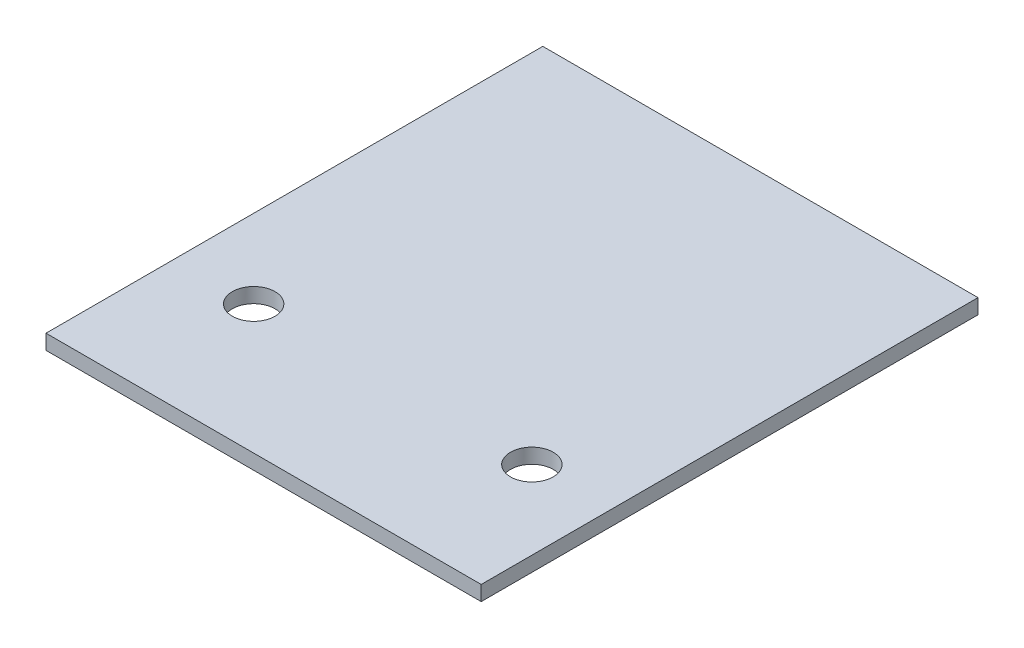
ISO-10303-21;
HEADER;
FILE_DESCRIPTION(('STEP AP214'),'2;1');
FILE_NAME('part.step','',(''),(''),'','','');
FILE_SCHEMA(('AUTOMOTIVE_DESIGN { 1 0 10303 214 1 1 1 1 }'));
ENDSEC;
DATA;
#1=APPLICATION_CONTEXT('core data for automotive mechanical design processes');
#2=APPLICATION_PROTOCOL_DEFINITION('international standard','automotive_design',2000,#1);
#3=PRODUCT_CONTEXT('',#1,'mechanical');
#4=PRODUCT('Part','Part','',(#3));
#5=PRODUCT_RELATED_PRODUCT_CATEGORY('part','',(#4));
#6=PRODUCT_DEFINITION_FORMATION('','',#4);
#7=PRODUCT_DEFINITION_CONTEXT('part definition',#1,'design');
#8=PRODUCT_DEFINITION('design','',#6,#7);
#9=PRODUCT_DEFINITION_SHAPE('','',#8);
#10=(LENGTH_UNIT() NAMED_UNIT(*) SI_UNIT(.MILLI.,.METRE.));
#11=(NAMED_UNIT(*) PLANE_ANGLE_UNIT() SI_UNIT($,.RADIAN.));
#12=(NAMED_UNIT(*) SI_UNIT($,.STERADIAN.) SOLID_ANGLE_UNIT());
#13=UNCERTAINTY_MEASURE_WITH_UNIT(LENGTH_MEASURE(1.E-05),#10,'distance_accuracy_value','');
#14=(GEOMETRIC_REPRESENTATION_CONTEXT(3) GLOBAL_UNCERTAINTY_ASSIGNED_CONTEXT((#13)) GLOBAL_UNIT_ASSIGNED_CONTEXT((#10,
#11,#12)) REPRESENTATION_CONTEXT('',''));
#15=CARTESIAN_POINT('',(0.,0.,0.));
#16=DIRECTION('',(0.,0.,1.));
#17=DIRECTION('',(1.,0.,0.));
#18=AXIS2_PLACEMENT_3D('',#15,#16,#17);
#19=CARTESIAN_POINT('',(21.9,1.5,25.));
#20=DIRECTION('',(-1.,0.,0.));
#21=DIRECTION('',(0.,0.,1.));
#22=AXIS2_PLACEMENT_3D('',#19,#20,#21);
#23=PLANE('',#22);
#24=DIRECTION('',(0.,0.,-1.));
#25=VECTOR('',#24,1.);
#26=CARTESIAN_POINT('',(21.9,0.,25.));
#27=LINE('',#26,#25);
#28=CARTESIAN_POINT('',(21.9,0.,25.));
#29=VERTEX_POINT('',#28);
#30=CARTESIAN_POINT('',(21.9,0.,-25.));
#31=VERTEX_POINT('',#30);
#32=EDGE_CURVE('E102',#29,#31,#27,.T.);
#33=ORIENTED_EDGE('',*,*,#32,.T.);
#34=DIRECTION('',(0.,-1.,0.));
#35=VECTOR('',#34,1.);
#36=CARTESIAN_POINT('',(21.9,1.5,-25.));
#37=LINE('',#36,#35);
#38=CARTESIAN_POINT('',(21.9,1.5,-25.));
#39=VERTEX_POINT('',#38);
#40=EDGE_CURVE('E11',#39,#31,#37,.T.);
#41=ORIENTED_EDGE('',*,*,#40,.F.);
#42=DIRECTION('',(0.,0.,-1.));
#43=VECTOR('',#42,1.);
#44=CARTESIAN_POINT('',(21.9,1.5,25.));
#45=LINE('',#44,#43);
#46=CARTESIAN_POINT('',(21.9,1.5,25.));
#47=VERTEX_POINT('',#46);
#48=EDGE_CURVE('E89',#47,#39,#45,.T.);
#49=ORIENTED_EDGE('',*,*,#48,.F.);
#50=DIRECTION('',(0.,-1.,0.));
#51=VECTOR('',#50,1.);
#52=CARTESIAN_POINT('',(21.9,1.5,25.));
#53=LINE('',#52,#51);
#54=EDGE_CURVE('E98',#47,#29,#53,.T.);
#55=ORIENTED_EDGE('',*,*,#54,.T.);
#56=EDGE_LOOP('',(#33,#41,#49,#55));
#57=FACE_BOUND('',#56,.T.);
#58=ADVANCED_FACE('F38',(#57),#23,.F.);
#59=CARTESIAN_POINT('',(-21.9,1.5,-25.));
#60=DIRECTION('',(0.,0.,1.));
#61=DIRECTION('',(1.,0.,0.));
#62=AXIS2_PLACEMENT_3D('',#59,#60,#61);
#63=PLANE('',#62);
#64=DIRECTION('',(-1.,0.,0.));
#65=VECTOR('',#64,1.);
#66=CARTESIAN_POINT('',(-21.9,0.,-25.));
#67=LINE('',#66,#65);
#68=CARTESIAN_POINT('',(-21.9,0.,-25.));
#69=VERTEX_POINT('',#68);
#70=EDGE_CURVE('E94',#31,#69,#67,.T.);
#71=ORIENTED_EDGE('',*,*,#70,.T.);
#72=DIRECTION('',(0.,-1.,0.));
#73=VECTOR('',#72,1.);
#74=CARTESIAN_POINT('',(-21.9,1.5,-25.));
#75=LINE('',#74,#73);
#76=CARTESIAN_POINT('',(-21.9,1.5,-25.));
#77=VERTEX_POINT('',#76);
#78=EDGE_CURVE('E46',#77,#69,#75,.T.);
#79=ORIENTED_EDGE('',*,*,#78,.F.);
#80=DIRECTION('',(-1.,0.,0.));
#81=VECTOR('',#80,1.);
#82=CARTESIAN_POINT('',(-21.9,1.5,-25.));
#83=LINE('',#82,#81);
#84=EDGE_CURVE('E84',#39,#77,#83,.T.);
#85=ORIENTED_EDGE('',*,*,#84,.F.);
#86=ORIENTED_EDGE('',*,*,#40,.T.);
#87=EDGE_LOOP('',(#71,#79,#85,#86));
#88=FACE_BOUND('',#87,.T.);
#89=ADVANCED_FACE('F93',(#88),#63,.F.);
#90=CARTESIAN_POINT('',(-21.9,1.5,25.));
#91=DIRECTION('',(1.,0.,0.));
#92=DIRECTION('',(0.,0.,-1.));
#93=AXIS2_PLACEMENT_3D('',#90,#91,#92);
#94=PLANE('',#93);
#95=DIRECTION('',(0.,0.,1.));
#96=VECTOR('',#95,1.);
#97=CARTESIAN_POINT('',(-21.9,0.,25.));
#98=LINE('',#97,#96);
#99=CARTESIAN_POINT('',(-21.9,0.,25.));
#100=VERTEX_POINT('',#99);
#101=EDGE_CURVE('E71',#69,#100,#98,.T.);
#102=ORIENTED_EDGE('',*,*,#101,.T.);
#103=DIRECTION('',(0.,-1.,0.));
#104=VECTOR('',#103,1.);
#105=CARTESIAN_POINT('',(-21.9,1.5,25.));
#106=LINE('',#105,#104);
#107=CARTESIAN_POINT('',(-21.9,1.5,25.));
#108=VERTEX_POINT('',#107);
#109=EDGE_CURVE('E95',#108,#100,#106,.T.);
#110=ORIENTED_EDGE('',*,*,#109,.F.);
#111=DIRECTION('',(0.,0.,1.));
#112=VECTOR('',#111,1.);
#113=CARTESIAN_POINT('',(-21.9,1.5,25.));
#114=LINE('',#113,#112);
#115=EDGE_CURVE('E87',#77,#108,#114,.T.);
#116=ORIENTED_EDGE('',*,*,#115,.F.);
#117=ORIENTED_EDGE('',*,*,#78,.T.);
#118=EDGE_LOOP('',(#102,#110,#116,#117));
#119=FACE_BOUND('',#118,.T.);
#120=ADVANCED_FACE('F96',(#119),#94,.F.);
#121=CARTESIAN_POINT('',(-21.9,1.5,25.));
#122=DIRECTION('',(0.,0.,-1.));
#123=DIRECTION('',(-1.,0.,0.));
#124=AXIS2_PLACEMENT_3D('',#121,#122,#123);
#125=PLANE('',#124);
#126=DIRECTION('',(1.,0.,0.));
#127=VECTOR('',#126,1.);
#128=CARTESIAN_POINT('',(-21.9,0.,25.));
#129=LINE('',#128,#127);
#130=EDGE_CURVE('E77',#100,#29,#129,.T.);
#131=ORIENTED_EDGE('',*,*,#130,.T.);
#132=ORIENTED_EDGE('',*,*,#54,.F.);
#133=DIRECTION('',(1.,0.,0.));
#134=VECTOR('',#133,1.);
#135=CARTESIAN_POINT('',(-21.9,1.5,25.));
#136=LINE('',#135,#134);
#137=EDGE_CURVE('E54',#108,#47,#136,.T.);
#138=ORIENTED_EDGE('',*,*,#137,.F.);
#139=ORIENTED_EDGE('',*,*,#109,.T.);
#140=EDGE_LOOP('',(#131,#132,#138,#139));
#141=FACE_BOUND('',#140,.T.);
#142=ADVANCED_FACE('F110',(#141),#125,.F.);
#143=CARTESIAN_POINT('',(0.,1.5,0.));
#144=DIRECTION('',(0.,-1.,0.));
#145=DIRECTION('',(0.,0.,-1.));
#146=AXIS2_PLACEMENT_3D('',#143,#144,#145);
#147=PLANE('',#146);
#148=CARTESIAN_POINT('',(-14.,1.5,12.));
#149=DIRECTION('',(0.,1.,0.));
#150=DIRECTION('',(0.,0.,1.));
#151=AXIS2_PLACEMENT_3D('',#148,#149,#150);
#152=CIRCLE('',#151,2.15);
#153=CARTESIAN_POINT('',(-14.,1.5,14.15));
#154=VERTEX_POINT('',#153);
#155=EDGE_CURVE('E124',#154,#154,#152,.T.);
#156=ORIENTED_EDGE('',*,*,#155,.F.);
#157=EDGE_LOOP('',(#156));
#158=FACE_BOUND('',#157,.T.);
#159=CARTESIAN_POINT('',(14.,1.5,12.));
#160=DIRECTION('',(0.,1.,0.));
#161=DIRECTION('',(0.,0.,1.));
#162=AXIS2_PLACEMENT_3D('',#159,#160,#161);
#163=CIRCLE('',#162,2.15);
#164=CARTESIAN_POINT('',(14.,1.5,14.15));
#165=VERTEX_POINT('',#164);
#166=EDGE_CURVE('E118',#165,#165,#163,.T.);
#167=ORIENTED_EDGE('',*,*,#166,.F.);
#168=EDGE_LOOP('',(#167));
#169=FACE_BOUND('',#168,.T.);
#170=ORIENTED_EDGE('',*,*,#48,.T.);
#171=ORIENTED_EDGE('',*,*,#84,.T.);
#172=ORIENTED_EDGE('',*,*,#115,.T.);
#173=ORIENTED_EDGE('',*,*,#137,.T.);
#174=EDGE_LOOP('',(#170,#171,#172,#173));
#175=FACE_BOUND('',#174,.T.);
#176=ADVANCED_FACE('F85',(#158,#169,#175),#147,.F.);
#177=CARTESIAN_POINT('',(0.,0.,0.));
#178=DIRECTION('',(0.,-1.,0.));
#179=DIRECTION('',(0.,0.,-1.));
#180=AXIS2_PLACEMENT_3D('',#177,#178,#179);
#181=PLANE('',#180);
#182=CARTESIAN_POINT('',(-14.,0.,12.));
#183=DIRECTION('',(0.,-1.,0.));
#184=DIRECTION('',(0.,0.,-1.));
#185=AXIS2_PLACEMENT_3D('',#182,#183,#184);
#186=CIRCLE('',#185,2.15);
#187=CARTESIAN_POINT('',(-14.,0.,9.85));
#188=VERTEX_POINT('',#187);
#189=EDGE_CURVE('E121',#188,#188,#186,.T.);
#190=ORIENTED_EDGE('',*,*,#189,.F.);
#191=EDGE_LOOP('',(#190));
#192=FACE_BOUND('',#191,.T.);
#193=CARTESIAN_POINT('',(14.,0.,12.));
#194=DIRECTION('',(0.,-1.,0.));
#195=DIRECTION('',(0.,0.,-1.));
#196=AXIS2_PLACEMENT_3D('',#193,#194,#195);
#197=CIRCLE('',#196,2.15);
#198=CARTESIAN_POINT('',(14.,0.,9.85));
#199=VERTEX_POINT('',#198);
#200=EDGE_CURVE('E105',#199,#199,#197,.T.);
#201=ORIENTED_EDGE('',*,*,#200,.F.);
#202=EDGE_LOOP('',(#201));
#203=FACE_BOUND('',#202,.T.);
#204=ORIENTED_EDGE('',*,*,#32,.F.);
#205=ORIENTED_EDGE('',*,*,#130,.F.);
#206=ORIENTED_EDGE('',*,*,#101,.F.);
#207=ORIENTED_EDGE('',*,*,#70,.F.);
#208=EDGE_LOOP('',(#204,#205,#206,#207));
#209=FACE_BOUND('',#208,.T.);
#210=ADVANCED_FACE('F113',(#192,#203,#209),#181,.T.);
#211=CARTESIAN_POINT('',(14.,1.5,12.));
#212=DIRECTION('',(0.,1.,0.));
#213=DIRECTION('',(0.,0.,1.));
#214=AXIS2_PLACEMENT_3D('',#211,#212,#213);
#215=CYLINDRICAL_SURFACE('',#214,2.15);
#216=ORIENTED_EDGE('',*,*,#200,.T.);
#217=EDGE_LOOP('',(#216));
#218=FACE_BOUND('',#217,.T.);
#219=ORIENTED_EDGE('',*,*,#166,.T.);
#220=EDGE_LOOP('',(#219));
#221=FACE_BOUND('',#220,.T.);
#222=ADVANCED_FACE('F135',(#218,#221),#215,.F.);
#223=CARTESIAN_POINT('',(-14.,1.5,12.));
#224=DIRECTION('',(0.,1.,0.));
#225=DIRECTION('',(0.,0.,1.));
#226=AXIS2_PLACEMENT_3D('',#223,#224,#225);
#227=CYLINDRICAL_SURFACE('',#226,2.15);
#228=ORIENTED_EDGE('',*,*,#189,.T.);
#229=EDGE_LOOP('',(#228));
#230=FACE_BOUND('',#229,.T.);
#231=ORIENTED_EDGE('',*,*,#155,.T.);
#232=EDGE_LOOP('',(#231));
#233=FACE_BOUND('',#232,.T.);
#234=ADVANCED_FACE('F128',(#230,#233),#227,.F.);
#235=CLOSED_SHELL('',(#58,#89,#120,#142,#176,#210,#222,#234));
#236=MANIFOLD_SOLID_BREP('B2',#235);
#237=ADVANCED_BREP_SHAPE_REPRESENTATION('',(#18,#236),#14);
#238=SHAPE_DEFINITION_REPRESENTATION(#9,#237);
ENDSEC;
END-ISO-10303-21;
